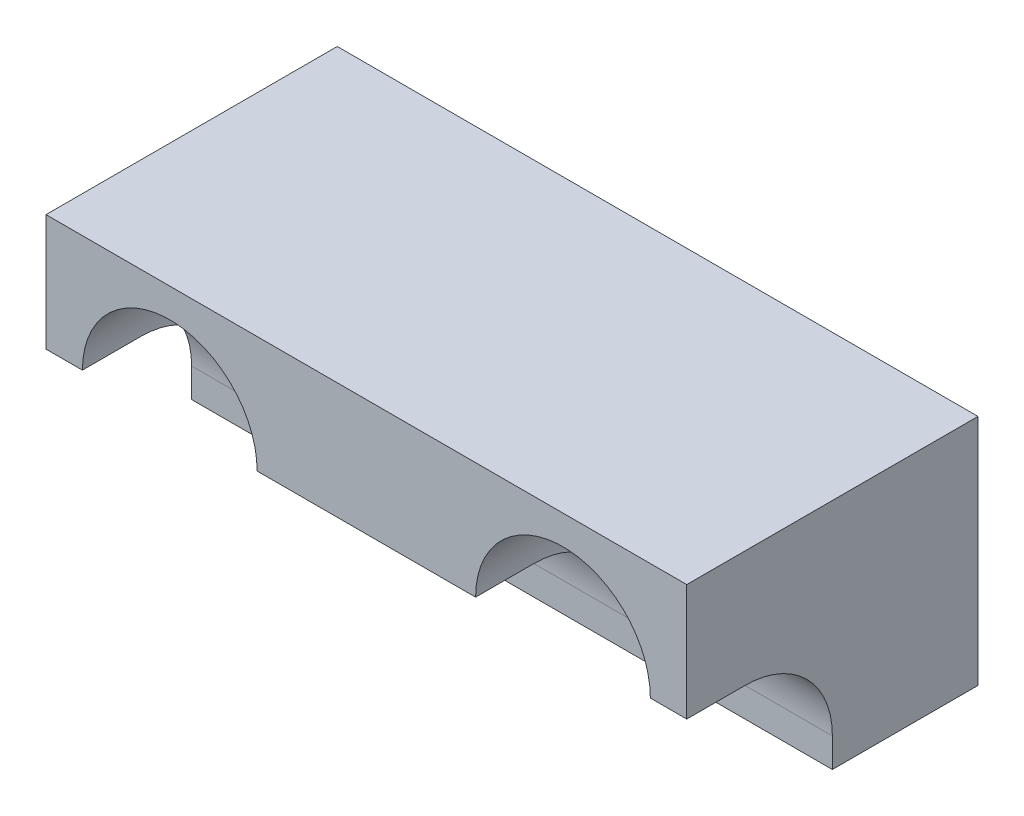
ISO-10303-21;
HEADER;
FILE_DESCRIPTION(('STEP AP214'),'2;1');
FILE_NAME('part.step','',(''),(''),'','','');
FILE_SCHEMA(('AUTOMOTIVE_DESIGN { 1 0 10303 214 1 1 1 1 }'));
ENDSEC;
DATA;
#1=APPLICATION_CONTEXT('core data for automotive mechanical design processes');
#2=APPLICATION_PROTOCOL_DEFINITION('international standard','automotive_design',2000,#1);
#3=PRODUCT_CONTEXT('',#1,'mechanical');
#4=PRODUCT('Part','Part','',(#3));
#5=PRODUCT_RELATED_PRODUCT_CATEGORY('part','',(#4));
#6=PRODUCT_DEFINITION_FORMATION('','',#4);
#7=PRODUCT_DEFINITION_CONTEXT('part definition',#1,'design');
#8=PRODUCT_DEFINITION('design','',#6,#7);
#9=PRODUCT_DEFINITION_SHAPE('','',#8);
#10=(LENGTH_UNIT() NAMED_UNIT(*) SI_UNIT(.MILLI.,.METRE.));
#11=(NAMED_UNIT(*) PLANE_ANGLE_UNIT() SI_UNIT($,.RADIAN.));
#12=(NAMED_UNIT(*) SI_UNIT($,.STERADIAN.) SOLID_ANGLE_UNIT());
#13=UNCERTAINTY_MEASURE_WITH_UNIT(LENGTH_MEASURE(1.E-05),#10,'distance_accuracy_value','');
#14=(GEOMETRIC_REPRESENTATION_CONTEXT(3) GLOBAL_UNCERTAINTY_ASSIGNED_CONTEXT((#13)) GLOBAL_UNIT_ASSIGNED_CONTEXT((#10,
#11,#12)) REPRESENTATION_CONTEXT('',''));
#15=CARTESIAN_POINT('',(0.,0.,0.));
#16=DIRECTION('',(0.,0.,1.));
#17=DIRECTION('',(1.,0.,0.));
#18=AXIS2_PLACEMENT_3D('',#15,#16,#17);
#19=CARTESIAN_POINT('',(0.,0.,5.));
#20=DIRECTION('',(0.,0.,-1.));
#21=DIRECTION('',(-1.,0.,0.));
#22=AXIS2_PLACEMENT_3D('',#19,#20,#21);
#23=PLANE('',#22);
#24=DIRECTION('',(0.,1.,0.));
#25=VECTOR('',#24,1.);
#26=CARTESIAN_POINT('',(11.,-4.,5.));
#27=LINE('',#26,#25);
#28=CARTESIAN_POINT('',(11.,-4.,5.));
#29=VERTEX_POINT('',#28);
#30=CARTESIAN_POINT('',(11.,-3.,5.));
#31=VERTEX_POINT('',#30);
#32=EDGE_CURVE('E214',#29,#31,#27,.T.);
#33=ORIENTED_EDGE('',*,*,#32,.T.);
#34=DIRECTION('',(1.,0.,0.));
#35=VECTOR('',#34,1.);
#36=CARTESIAN_POINT('',(9.75,-3.,5.));
#37=LINE('',#36,#35);
#38=CARTESIAN_POINT('',(6.75,-3.,5.));
#39=VERTEX_POINT('',#38);
#40=EDGE_CURVE('E242',#31,#39,#37,.F.);
#41=ORIENTED_EDGE('',*,*,#40,.T.);
#42=DIRECTION('',(1.,0.,0.));
#43=VECTOR('',#42,1.);
#44=CARTESIAN_POINT('',(-3.75,-3.,5.));
#45=LINE('',#44,#43);
#46=CARTESIAN_POINT('',(-6.75,-3.,5.));
#47=VERTEX_POINT('',#46);
#48=EDGE_CURVE('E237',#39,#47,#45,.F.);
#49=ORIENTED_EDGE('',*,*,#48,.T.);
#50=DIRECTION('',(1.,0.,0.));
#51=VECTOR('',#50,1.);
#52=CARTESIAN_POINT('',(-11.,-3.,5.));
#53=LINE('',#52,#51);
#54=CARTESIAN_POINT('',(-11.,-3.,5.));
#55=VERTEX_POINT('',#54);
#56=EDGE_CURVE('E240',#47,#55,#53,.F.);
#57=ORIENTED_EDGE('',*,*,#56,.T.);
#58=DIRECTION('',(0.,-1.,0.));
#59=VECTOR('',#58,1.);
#60=CARTESIAN_POINT('',(-11.,-4.,5.));
#61=LINE('',#60,#59);
#62=CARTESIAN_POINT('',(-11.,-4.,5.));
#63=VERTEX_POINT('',#62);
#64=EDGE_CURVE('E217',#55,#63,#61,.T.);
#65=ORIENTED_EDGE('',*,*,#64,.T.);
#66=DIRECTION('',(1.,0.,0.));
#67=VECTOR('',#66,1.);
#68=CARTESIAN_POINT('',(-11.,-4.,5.));
#69=LINE('',#68,#67);
#70=EDGE_CURVE('E220',#63,#29,#69,.T.);
#71=ORIENTED_EDGE('',*,*,#70,.T.);
#72=EDGE_LOOP('',(#33,#41,#49,#57,#65,#71));
#73=FACE_BOUND('',#72,.T.);
#74=ADVANCED_FACE('F33',(#73),#23,.F.);
#75=CARTESIAN_POINT('',(-6.75,0.,5.));
#76=DIRECTION('',(0.,0.,1.));
#77=DIRECTION('',(1.,0.,0.));
#78=AXIS2_PLACEMENT_3D('',#75,#76,#77);
#79=CIRCLE('',#78,1.5);
#80=CARTESIAN_POINT('',(-5.25,0.,5.));
#81=VERTEX_POINT('',#80);
#82=EDGE_CURVE('E208',#81,#81,#79,.T.);
#83=ORIENTED_EDGE('',*,*,#82,.F.);
#84=EDGE_LOOP('',(#83));
#85=FACE_BOUND('',#84,.T.);
#86=CARTESIAN_POINT('',(-6.75,0.,5.));
#87=DIRECTION('',(0.,0.,-1.));
#88=DIRECTION('',(-1.,0.,0.));
#89=AXIS2_PLACEMENT_3D('',#86,#87,#88);
#90=CIRCLE('',#89,3.);
#91=EDGE_CURVE('E147',#47,#47,#90,.T.);
#92=ORIENTED_EDGE('',*,*,#91,.F.);
#93=EDGE_LOOP('',(#92));
#94=FACE_BOUND('',#93,.T.);
#95=ADVANCED_FACE('F281',(#85,#94),#23,.F.);
#96=CARTESIAN_POINT('',(-11.,0.,10.));
#97=DIRECTION('',(0.,1.,0.));
#98=DIRECTION('',(0.,0.,1.));
#99=AXIS2_PLACEMENT_3D('',#96,#97,#98);
#100=PLANE('',#99);
#101=DIRECTION('',(0.,0.,-1.));
#102=VECTOR('',#101,1.);
#103=CARTESIAN_POINT('',(9.75,0.,10.));
#104=LINE('',#103,#102);
#105=CARTESIAN_POINT('',(9.75,0.,10.));
#106=VERTEX_POINT('',#105);
#107=CARTESIAN_POINT('',(9.75,0.,8.));
#108=VERTEX_POINT('',#107);
#109=EDGE_CURVE('E165',#106,#108,#104,.T.);
#110=ORIENTED_EDGE('',*,*,#109,.T.);
#111=DIRECTION('',(1.,0.,0.));
#112=VECTOR('',#111,1.);
#113=CARTESIAN_POINT('',(11.,0.,8.));
#114=LINE('',#113,#112);
#115=CARTESIAN_POINT('',(11.,0.,8.));
#116=VERTEX_POINT('',#115);
#117=EDGE_CURVE('E185',#108,#116,#114,.T.);
#118=ORIENTED_EDGE('',*,*,#117,.T.);
#119=DIRECTION('',(0.,0.,-1.));
#120=VECTOR('',#119,1.);
#121=CARTESIAN_POINT('',(11.,0.,10.));
#122=LINE('',#121,#120);
#123=CARTESIAN_POINT('',(11.,0.,10.));
#124=VERTEX_POINT('',#123);
#125=EDGE_CURVE('E183',#124,#116,#122,.T.);
#126=ORIENTED_EDGE('',*,*,#125,.F.);
#127=DIRECTION('',(1.,0.,0.));
#128=VECTOR('',#127,1.);
#129=CARTESIAN_POINT('',(-11.,0.,10.));
#130=LINE('',#129,#128);
#131=EDGE_CURVE('E158',#106,#124,#130,.T.);
#132=ORIENTED_EDGE('',*,*,#131,.F.);
#133=EDGE_LOOP('',(#110,#118,#126,#132));
#134=FACE_BOUND('',#133,.T.);
#135=ADVANCED_FACE('F179',(#134),#100,.F.);
#136=DIRECTION('',(0.,0.,-1.));
#137=VECTOR('',#136,1.);
#138=CARTESIAN_POINT('',(-3.75,0.,10.));
#139=LINE('',#138,#137);
#140=CARTESIAN_POINT('',(-3.75,0.,10.));
#141=VERTEX_POINT('',#140);
#142=CARTESIAN_POINT('',(-3.75,0.,8.));
#143=VERTEX_POINT('',#142);
#144=EDGE_CURVE('E137',#141,#143,#139,.T.);
#145=ORIENTED_EDGE('',*,*,#144,.T.);
#146=DIRECTION('',(1.,0.,0.));
#147=VECTOR('',#146,1.);
#148=CARTESIAN_POINT('',(3.75,0.,8.));
#149=LINE('',#148,#147);
#150=CARTESIAN_POINT('',(3.75,0.,8.));
#151=VERTEX_POINT('',#150);
#152=EDGE_CURVE('E246',#143,#151,#149,.T.);
#153=ORIENTED_EDGE('',*,*,#152,.T.);
#154=DIRECTION('',(0.,0.,-1.));
#155=VECTOR('',#154,1.);
#156=CARTESIAN_POINT('',(3.75,0.,10.));
#157=LINE('',#156,#155);
#158=CARTESIAN_POINT('',(3.75,0.,10.));
#159=VERTEX_POINT('',#158);
#160=EDGE_CURVE('E167',#151,#159,#157,.F.);
#161=ORIENTED_EDGE('',*,*,#160,.T.);
#162=EDGE_CURVE('E156',#141,#159,#130,.T.);
#163=ORIENTED_EDGE('',*,*,#162,.F.);
#164=EDGE_LOOP('',(#145,#153,#161,#163));
#165=FACE_BOUND('',#164,.T.);
#166=ADVANCED_FACE('F293',(#165),#100,.F.);
#167=CARTESIAN_POINT('',(6.75,0.,5.));
#168=DIRECTION('',(0.,0.,-1.));
#169=DIRECTION('',(-1.,0.,0.));
#170=AXIS2_PLACEMENT_3D('',#167,#168,#169);
#171=CIRCLE('',#170,3.);
#172=EDGE_CURVE('E146',#39,#39,#171,.T.);
#173=ORIENTED_EDGE('',*,*,#172,.F.);
#174=EDGE_LOOP('',(#173));
#175=FACE_BOUND('',#174,.T.);
#176=CARTESIAN_POINT('',(6.75,0.,5.));
#177=DIRECTION('',(0.,0.,1.));
#178=DIRECTION('',(1.,0.,0.));
#179=AXIS2_PLACEMENT_3D('',#176,#177,#178);
#180=CIRCLE('',#179,1.5);
#181=CARTESIAN_POINT('',(8.25,0.,5.));
#182=VERTEX_POINT('',#181);
#183=EDGE_CURVE('E202',#182,#182,#180,.T.);
#184=ORIENTED_EDGE('',*,*,#183,.F.);
#185=EDGE_LOOP('',(#184));
#186=FACE_BOUND('',#185,.T.);
#187=ADVANCED_FACE('F284',(#175,#186),#23,.F.);
#188=CARTESIAN_POINT('',(0.,0.,0.));
#189=DIRECTION('',(0.,0.,-1.));
#190=DIRECTION('',(-1.,0.,0.));
#191=AXIS2_PLACEMENT_3D('',#188,#189,#190);
#192=PLANE('',#191);
#193=CARTESIAN_POINT('',(-6.75,0.,0.));
#194=DIRECTION('',(0.,0.,1.));
#195=DIRECTION('',(1.,0.,0.));
#196=AXIS2_PLACEMENT_3D('',#193,#194,#195);
#197=CIRCLE('',#196,1.5);
#198=CARTESIAN_POINT('',(-5.25,0.,0.));
#199=VERTEX_POINT('',#198);
#200=EDGE_CURVE('E205',#199,#199,#197,.T.);
#201=ORIENTED_EDGE('',*,*,#200,.T.);
#202=EDGE_LOOP('',(#201));
#203=FACE_BOUND('',#202,.T.);
#204=DIRECTION('',(0.,1.,0.));
#205=VECTOR('',#204,1.);
#206=CARTESIAN_POINT('',(11.,-4.,0.));
#207=LINE('',#206,#205);
#208=CARTESIAN_POINT('',(11.,-4.,0.));
#209=VERTEX_POINT('',#208);
#210=CARTESIAN_POINT('',(11.,4.,0.));
#211=VERTEX_POINT('',#210);
#212=EDGE_CURVE('E211',#209,#211,#207,.T.);
#213=ORIENTED_EDGE('',*,*,#212,.F.);
#214=DIRECTION('',(1.,0.,0.));
#215=VECTOR('',#214,1.);
#216=CARTESIAN_POINT('',(-11.,-4.,0.));
#217=LINE('',#216,#215);
#218=CARTESIAN_POINT('',(-11.,-4.,0.));
#219=VERTEX_POINT('',#218);
#220=EDGE_CURVE('E218',#219,#209,#217,.T.);
#221=ORIENTED_EDGE('',*,*,#220,.F.);
#222=DIRECTION('',(0.,-1.,0.));
#223=VECTOR('',#222,1.);
#224=CARTESIAN_POINT('',(-11.,-4.,0.));
#225=LINE('',#224,#223);
#226=CARTESIAN_POINT('',(-11.,4.,0.));
#227=VERTEX_POINT('',#226);
#228=EDGE_CURVE('E226',#227,#219,#225,.T.);
#229=ORIENTED_EDGE('',*,*,#228,.F.);
#230=DIRECTION('',(-1.,0.,0.));
#231=VECTOR('',#230,1.);
#232=CARTESIAN_POINT('',(-11.,4.,0.));
#233=LINE('',#232,#231);
#234=EDGE_CURVE('E224',#211,#227,#233,.T.);
#235=ORIENTED_EDGE('',*,*,#234,.F.);
#236=EDGE_LOOP('',(#213,#221,#229,#235));
#237=FACE_BOUND('',#236,.T.);
#238=CARTESIAN_POINT('',(6.75,0.,0.));
#239=DIRECTION('',(0.,0.,1.));
#240=DIRECTION('',(1.,0.,0.));
#241=AXIS2_PLACEMENT_3D('',#238,#239,#240);
#242=CIRCLE('',#241,1.5);
#243=CARTESIAN_POINT('',(8.25,0.,0.));
#244=VERTEX_POINT('',#243);
#245=EDGE_CURVE('E201',#244,#244,#242,.T.);
#246=ORIENTED_EDGE('',*,*,#245,.T.);
#247=EDGE_LOOP('',(#246));
#248=FACE_BOUND('',#247,.T.);
#249=ADVANCED_FACE('F292',(#203,#237,#248),#192,.T.);
#250=CARTESIAN_POINT('',(11.,-4.,5.));
#251=DIRECTION('',(-1.,0.,0.));
#252=DIRECTION('',(0.,0.,1.));
#253=AXIS2_PLACEMENT_3D('',#250,#251,#252);
#254=PLANE('',#253);
#255=ORIENTED_EDGE('',*,*,#212,.T.);
#256=DIRECTION('',(0.,0.,-1.));
#257=VECTOR('',#256,1.);
#258=CARTESIAN_POINT('',(11.,4.,5.));
#259=LINE('',#258,#257);
#260=CARTESIAN_POINT('',(11.,4.,10.));
#261=VERTEX_POINT('',#260);
#262=EDGE_CURVE('E192',#261,#211,#259,.T.);
#263=ORIENTED_EDGE('',*,*,#262,.F.);
#264=DIRECTION('',(0.,1.,0.));
#265=VECTOR('',#264,1.);
#266=CARTESIAN_POINT('',(11.,4.,10.));
#267=LINE('',#266,#265);
#268=EDGE_CURVE('E155',#124,#261,#267,.T.);
#269=ORIENTED_EDGE('',*,*,#268,.F.);
#270=ORIENTED_EDGE('',*,*,#125,.T.);
#271=CARTESIAN_POINT('',(11.,-3.,8.));
#272=DIRECTION('',(-1.,0.,0.));
#273=DIRECTION('',(0.,0.,1.));
#274=AXIS2_PLACEMENT_3D('',#271,#272,#273);
#275=CIRCLE('',#274,3.);
#276=EDGE_CURVE('E248',#116,#31,#275,.T.);
#277=ORIENTED_EDGE('',*,*,#276,.T.);
#278=ORIENTED_EDGE('',*,*,#32,.F.);
#279=DIRECTION('',(0.,0.,-1.));
#280=VECTOR('',#279,1.);
#281=CARTESIAN_POINT('',(11.,-4.,5.));
#282=LINE('',#281,#280);
#283=EDGE_CURVE('E222',#29,#209,#282,.T.);
#284=ORIENTED_EDGE('',*,*,#283,.T.);
#285=EDGE_LOOP('',(#255,#263,#269,#270,#277,#278,#284));
#286=FACE_BOUND('',#285,.T.);
#287=ADVANCED_FACE('F190',(#286),#254,.F.);
#288=CARTESIAN_POINT('',(-11.,4.,5.));
#289=DIRECTION('',(0.,-1.,0.));
#290=DIRECTION('',(0.,0.,-1.));
#291=AXIS2_PLACEMENT_3D('',#288,#289,#290);
#292=PLANE('',#291);
#293=ORIENTED_EDGE('',*,*,#234,.T.);
#294=DIRECTION('',(0.,0.,-1.));
#295=VECTOR('',#294,1.);
#296=CARTESIAN_POINT('',(-11.,4.,5.));
#297=LINE('',#296,#295);
#298=CARTESIAN_POINT('',(-11.,4.,10.));
#299=VERTEX_POINT('',#298);
#300=EDGE_CURVE('E197',#299,#227,#297,.T.);
#301=ORIENTED_EDGE('',*,*,#300,.F.);
#302=DIRECTION('',(-1.,0.,0.));
#303=VECTOR('',#302,1.);
#304=CARTESIAN_POINT('',(-11.,4.,10.));
#305=LINE('',#304,#303);
#306=EDGE_CURVE('E160',#261,#299,#305,.T.);
#307=ORIENTED_EDGE('',*,*,#306,.F.);
#308=ORIENTED_EDGE('',*,*,#262,.T.);
#309=EDGE_LOOP('',(#293,#301,#307,#308));
#310=FACE_BOUND('',#309,.T.);
#311=ADVANCED_FACE('F195',(#310),#292,.F.);
#312=CARTESIAN_POINT('',(-11.,-4.,5.));
#313=DIRECTION('',(1.,0.,0.));
#314=DIRECTION('',(0.,0.,-1.));
#315=AXIS2_PLACEMENT_3D('',#312,#313,#314);
#316=PLANE('',#315);
#317=ORIENTED_EDGE('',*,*,#228,.T.);
#318=DIRECTION('',(0.,0.,-1.));
#319=VECTOR('',#318,1.);
#320=CARTESIAN_POINT('',(-11.,-4.,5.));
#321=LINE('',#320,#319);
#322=EDGE_CURVE('E231',#63,#219,#321,.T.);
#323=ORIENTED_EDGE('',*,*,#322,.F.);
#324=ORIENTED_EDGE('',*,*,#64,.F.);
#325=CARTESIAN_POINT('',(-11.,-3.,8.));
#326=DIRECTION('',(1.,0.,0.));
#327=DIRECTION('',(0.,0.,-1.));
#328=AXIS2_PLACEMENT_3D('',#325,#326,#327);
#329=CIRCLE('',#328,3.);
#330=CARTESIAN_POINT('',(-11.,0.,8.));
#331=VERTEX_POINT('',#330);
#332=EDGE_CURVE('E467',#55,#331,#329,.T.);
#333=ORIENTED_EDGE('',*,*,#332,.T.);
#334=DIRECTION('',(0.,0.,-1.));
#335=VECTOR('',#334,1.);
#336=CARTESIAN_POINT('',(-11.,0.,10.));
#337=LINE('',#336,#335);
#338=CARTESIAN_POINT('',(-11.,0.,10.));
#339=VERTEX_POINT('',#338);
#340=EDGE_CURVE('E187',#339,#331,#337,.T.);
#341=ORIENTED_EDGE('',*,*,#340,.F.);
#342=DIRECTION('',(0.,-1.,0.));
#343=VECTOR('',#342,1.);
#344=CARTESIAN_POINT('',(-11.,4.,10.));
#345=LINE('',#344,#343);
#346=EDGE_CURVE('E153',#299,#339,#345,.T.);
#347=ORIENTED_EDGE('',*,*,#346,.F.);
#348=ORIENTED_EDGE('',*,*,#300,.T.);
#349=EDGE_LOOP('',(#317,#323,#324,#333,#341,#347,#348));
#350=FACE_BOUND('',#349,.T.);
#351=ADVANCED_FACE('F393',(#350),#316,.F.);
#352=CARTESIAN_POINT('',(-11.,-4.,5.));
#353=DIRECTION('',(0.,1.,0.));
#354=DIRECTION('',(0.,0.,1.));
#355=AXIS2_PLACEMENT_3D('',#352,#353,#354);
#356=PLANE('',#355);
#357=ORIENTED_EDGE('',*,*,#220,.T.);
#358=ORIENTED_EDGE('',*,*,#283,.F.);
#359=ORIENTED_EDGE('',*,*,#70,.F.);
#360=ORIENTED_EDGE('',*,*,#322,.T.);
#361=EDGE_LOOP('',(#357,#358,#359,#360));
#362=FACE_BOUND('',#361,.T.);
#363=ADVANCED_FACE('F316',(#362),#356,.F.);
#364=CARTESIAN_POINT('',(-6.75,0.,5.));
#365=DIRECTION('',(0.,0.,-1.));
#366=DIRECTION('',(-1.,0.,0.));
#367=AXIS2_PLACEMENT_3D('',#364,#365,#366);
#368=CYLINDRICAL_SURFACE('',#367,1.5);
#369=ORIENTED_EDGE('',*,*,#82,.T.);
#370=EDGE_LOOP('',(#369));
#371=FACE_BOUND('',#370,.T.);
#372=ORIENTED_EDGE('',*,*,#200,.F.);
#373=EDGE_LOOP('',(#372));
#374=FACE_BOUND('',#373,.T.);
#375=ADVANCED_FACE('F308',(#371,#374),#368,.F.);
#376=CARTESIAN_POINT('',(6.75,0.,5.));
#377=DIRECTION('',(0.,0.,-1.));
#378=DIRECTION('',(-1.,0.,0.));
#379=AXIS2_PLACEMENT_3D('',#376,#377,#378);
#380=CYLINDRICAL_SURFACE('',#379,1.5);
#381=ORIENTED_EDGE('',*,*,#183,.T.);
#382=EDGE_LOOP('',(#381));
#383=FACE_BOUND('',#382,.T.);
#384=ORIENTED_EDGE('',*,*,#245,.F.);
#385=EDGE_LOOP('',(#384));
#386=FACE_BOUND('',#385,.T.);
#387=ADVANCED_FACE('F305',(#383,#386),#380,.F.);
#388=ORIENTED_EDGE('',*,*,#340,.T.);
#389=DIRECTION('',(1.,0.,0.));
#390=VECTOR('',#389,1.);
#391=CARTESIAN_POINT('',(-9.75,0.,8.));
#392=LINE('',#391,#390);
#393=CARTESIAN_POINT('',(-9.75,0.,8.));
#394=VERTEX_POINT('',#393);
#395=EDGE_CURVE('E135',#331,#394,#392,.T.);
#396=ORIENTED_EDGE('',*,*,#395,.T.);
#397=DIRECTION('',(0.,0.,-1.));
#398=VECTOR('',#397,1.);
#399=CARTESIAN_POINT('',(-9.75,0.,10.));
#400=LINE('',#399,#398);
#401=CARTESIAN_POINT('',(-9.75,0.,10.));
#402=VERTEX_POINT('',#401);
#403=EDGE_CURVE('E127',#394,#402,#400,.F.);
#404=ORIENTED_EDGE('',*,*,#403,.T.);
#405=EDGE_CURVE('E132',#339,#402,#130,.T.);
#406=ORIENTED_EDGE('',*,*,#405,.F.);
#407=EDGE_LOOP('',(#388,#396,#404,#406));
#408=FACE_BOUND('',#407,.T.);
#409=ADVANCED_FACE('F130',(#408),#100,.F.);
#410=CARTESIAN_POINT('',(0.,0.,10.));
#411=DIRECTION('',(0.,0.,1.));
#412=DIRECTION('',(1.,0.,0.));
#413=AXIS2_PLACEMENT_3D('',#410,#411,#412);
#414=PLANE('',#413);
#415=CARTESIAN_POINT('',(6.75,0.,10.));
#416=DIRECTION('',(0.,0.,-1.));
#417=DIRECTION('',(-1.,0.,0.));
#418=AXIS2_PLACEMENT_3D('',#415,#416,#417);
#419=CIRCLE('',#418,3.);
#420=EDGE_CURVE('E138',#159,#106,#419,.T.);
#421=ORIENTED_EDGE('',*,*,#420,.T.);
#422=ORIENTED_EDGE('',*,*,#131,.T.);
#423=ORIENTED_EDGE('',*,*,#268,.T.);
#424=ORIENTED_EDGE('',*,*,#306,.T.);
#425=ORIENTED_EDGE('',*,*,#346,.T.);
#426=ORIENTED_EDGE('',*,*,#405,.T.);
#427=CARTESIAN_POINT('',(-6.75,0.,10.));
#428=DIRECTION('',(0.,0.,-1.));
#429=DIRECTION('',(-1.,0.,0.));
#430=AXIS2_PLACEMENT_3D('',#427,#428,#429);
#431=CIRCLE('',#430,3.);
#432=EDGE_CURVE('E141',#402,#141,#431,.T.);
#433=ORIENTED_EDGE('',*,*,#432,.T.);
#434=ORIENTED_EDGE('',*,*,#162,.T.);
#435=EDGE_LOOP('',(#421,#422,#423,#424,#425,#426,#433,#434));
#436=FACE_BOUND('',#435,.T.);
#437=ADVANCED_FACE('F150',(#436),#414,.T.);
#438=CARTESIAN_POINT('',(-6.75,0.,10.));
#439=DIRECTION('',(0.,0.,-1.));
#440=DIRECTION('',(-1.,0.,0.));
#441=AXIS2_PLACEMENT_3D('',#438,#439,#440);
#442=CYLINDRICAL_SURFACE('',#441,3.);
#443=ORIENTED_EDGE('',*,*,#432,.F.);
#444=ORIENTED_EDGE('',*,*,#403,.F.);
#445=CARTESIAN_POINT('',(-9.75,0.,8.));
#446=CARTESIAN_POINT('',(-9.7499742542119,8.70117092402358E-06,7.91648721347913));
#447=CARTESIAN_POINT('',(-9.74999919002557,-0.00348683371941922,7.83297564664489));
#448=CARTESIAN_POINT('',(-9.74996437324022,-0.0174237793873351,7.66653448961));
#449=CARTESIAN_POINT('',(-9.74990462115681,-0.0278651478770789,7.58360489586926));
#450=CARTESIAN_POINT('',(-9.74951403800987,-0.0556555827604354,7.41876135883009));
#451=CARTESIAN_POINT('',(-9.74918273036921,-0.0730167658160934,7.33684945833349));
#452=CARTESIAN_POINT('',(-9.7478856829385,-0.114521091377206,7.17476758070851));
#453=CARTESIAN_POINT('',(-9.746919951357,-0.138664146132445,7.09459758105624));
#454=CARTESIAN_POINT('',(-9.74387405147011,-0.193581567204843,6.93650390680158));
#455=CARTESIAN_POINT('',(-9.74179292557354,-0.224361617941497,6.85858222309648));
#456=CARTESIAN_POINT('',(-9.73591899970483,-0.292320236229917,6.70559715283823));
#457=CARTESIAN_POINT('',(-9.73212535807626,-0.329501944462847,6.63053519145773));
#458=CARTESIAN_POINT('',(-9.72213985150084,-0.40990715480478,6.4839521366029));
#459=CARTESIAN_POINT('',(-9.71594974906587,-0.453126201768672,6.41242848432597));
#460=CARTESIAN_POINT('',(-9.70041644033445,-0.545177918798996,6.27350477907446));
#461=CARTESIAN_POINT('',(-9.69107521881053,-0.594007042552509,6.20610216190273));
#462=CARTESIAN_POINT('',(-9.66887939514974,-0.694766057870571,6.07847710273515));
#463=CARTESIAN_POINT('',(-9.65617339810132,-0.746505012734441,6.0180783705127));
#464=CARTESIAN_POINT('',(-9.62642042750599,-0.853997612791838,5.90216393374337));
#465=CARTESIAN_POINT('',(-9.60937585028495,-0.909749029631128,5.84664555633254));
#466=CARTESIAN_POINT('',(-9.57032529473745,-1.02441614168453,5.74098692128325));
#467=CARTESIAN_POINT('',(-9.54832432064532,-1.0833285999568,5.69084131385461));
#468=CARTESIAN_POINT('',(-9.49883315091997,-1.20338169859462,5.59625304372244));
#469=CARTESIAN_POINT('',(-9.4713439106332,-1.26452194965455,5.55180939068416));
#470=CARTESIAN_POINT('',(-9.41468460966073,-1.3794871949622,5.47451722162952));
#471=CARTESIAN_POINT('',(-9.38625556065377,-1.43317216047316,5.44091401931685));
#472=CARTESIAN_POINT('',(-9.32493793719987,-1.54062378554782,5.37815083109316));
#473=CARTESIAN_POINT('',(-9.29204796826319,-1.59439046543791,5.34899224065172));
#474=CARTESIAN_POINT('',(-9.22184175433683,-1.70119898901481,5.29506119487445));
#475=CARTESIAN_POINT('',(-9.18452705153268,-1.75424107810234,5.27028721879635));
#476=CARTESIAN_POINT('',(-9.10559189296625,-1.85889613304526,5.22490705961105));
#477=CARTESIAN_POINT('',(-9.06396977483469,-1.91050853732507,5.20430249474728));
#478=CARTESIAN_POINT('',(-8.93804553014366,-2.05626299068615,5.15050262838392));
#479=CARTESIAN_POINT('',(-8.84847880587433,-2.14776514544236,5.12223133391004));
#480=CARTESIAN_POINT('',(-8.65684490292335,-2.31960343278214,5.07681693751965));
#481=CARTESIAN_POINT('',(-8.55477472204774,-2.39993687373126,5.05967651447669));
#482=CARTESIAN_POINT('',(-8.32978618993133,-2.55434526471839,5.03214864283832));
#483=CARTESIAN_POINT('',(-8.20580434257178,-2.62701609628219,5.02259644061977));
#484=CARTESIAN_POINT('',(-7.9483641146747,-2.7540051655726,5.00941685009246));
#485=CARTESIAN_POINT('',(-7.81489793320139,-2.80830807908633,5.00579439930442));
#486=CARTESIAN_POINT('',(-7.60349864787223,-2.87710726525327,5.00242199021814));
#487=CARTESIAN_POINT('',(-7.52774981708906,-2.89849933282714,5.00166158575046));
#488=CARTESIAN_POINT('',(-7.37478106781804,-2.93527364149273,5.00064147476753));
#489=CARTESIAN_POINT('',(-7.29756101896835,-2.95065534739584,5.00038181283246));
#490=CARTESIAN_POINT('',(-7.14219105636118,-2.97529318753805,5.00007517346278));
#491=CARTESIAN_POINT('',(-7.06404159901899,-2.98455221154377,5.00002809563205));
#492=CARTESIAN_POINT('',(-6.90726230315864,-2.99690853233646,5.00000054521932));
#493=CARTESIAN_POINT('',(-6.8286324963443,-3.00000623146601,5.00002006828797));
#494=CARTESIAN_POINT('',(-6.75,-3.,5.));
#495=B_SPLINE_CURVE_WITH_KNOTS('',3,(#445,#446,#447,#448,#449,#450,#451,#452,#453,#454,#455,
#456,#457,#458,#459,#460,#461,#462,#463,#464,#465,#466,#467,#468,#469,#470,#471,#472,#473,#474,
#475,#476,#477,#478,#479,#480,#481,#482,#483,#484,#485,#486,#487,#488,#489,#490,#491,#492,#493,
#494),.UNSPECIFIED.,.F.,.F.,(4,2,2,2,2,2,2,2,2,2,2,2,2,2,2,2,2,2,2,2,2,2,2,2,4),(0.,
0.250463504184519,0.500925483503707,0.751827964491764,1.00272719921772,1.25384218245193,
1.50508071668819,1.75613482385013,2.00703109572428,2.24829786825918,2.48943167010185,
2.73032309333807,2.97117262093231,3.17916209948991,3.38721674634572,3.5951990903332,
3.80326200282563,4.19483860442291,4.58650941210566,5.01690577111382,5.44766032590578,
5.68359780105507,5.9195562803125,6.15540331289395,6.39123494384964),.UNSPECIFIED.);
#496=EDGE_CURVE('E258',#394,#47,#495,.T.);
#497=ORIENTED_EDGE('',*,*,#496,.T.);
#498=ORIENTED_EDGE('',*,*,#91,.T.);
#499=CARTESIAN_POINT('',(-6.75,-3.,5.));
#500=CARTESIAN_POINT('',(-6.66648721347913,-3.00000870117092,5.0000257457881));
#501=CARTESIAN_POINT('',(-6.58297564664489,-2.99651316628058,5.00000080997444));
#502=CARTESIAN_POINT('',(-6.41653448961,-2.98257622061266,5.00003562675978));
#503=CARTESIAN_POINT('',(-6.33360489586926,-2.97213485212292,5.00009537884319));
#504=CARTESIAN_POINT('',(-6.16876135883009,-2.94434441723956,5.00048596199013));
#505=CARTESIAN_POINT('',(-6.08684945833349,-2.92698323418391,5.00081726963079));
#506=CARTESIAN_POINT('',(-5.92476758070851,-2.88547890862279,5.00211431706151));
#507=CARTESIAN_POINT('',(-5.84459758105624,-2.86133585386756,5.00308004864301));
#508=CARTESIAN_POINT('',(-5.68650390680158,-2.80641843279516,5.00612594852989));
#509=CARTESIAN_POINT('',(-5.60858222309648,-2.7756383820585,5.00820707442646));
#510=CARTESIAN_POINT('',(-5.45559715283823,-2.70767976377008,5.01408100029517));
#511=CARTESIAN_POINT('',(-5.38053519145773,-2.67049805553715,5.01787464192374));
#512=CARTESIAN_POINT('',(-5.2339521366029,-2.59009284519522,5.02786014849917));
#513=CARTESIAN_POINT('',(-5.16242848432597,-2.54687379823133,5.03405025093413));
#514=CARTESIAN_POINT('',(-5.02350477907445,-2.454822081201,5.04958355966555));
#515=CARTESIAN_POINT('',(-4.95610216190273,-2.40599295744749,5.05892478118947));
#516=CARTESIAN_POINT('',(-4.82847710273515,-2.30523394212943,5.08112060485026));
#517=CARTESIAN_POINT('',(-4.7680783705127,-2.25349498726556,5.09382660189868));
#518=CARTESIAN_POINT('',(-4.65216393374337,-2.14600238720816,5.12357957249401));
#519=CARTESIAN_POINT('',(-4.59664555633254,-2.09025097036887,5.14062414971505));
#520=CARTESIAN_POINT('',(-4.49098692128325,-1.97558385831547,5.17967470526256));
#521=CARTESIAN_POINT('',(-4.44084131385461,-1.9166714000432,5.20167567935468));
#522=CARTESIAN_POINT('',(-4.34625304372244,-1.79661830140538,5.25116684908003));
#523=CARTESIAN_POINT('',(-4.30180939068416,-1.73547805034545,5.2786560893668));
#524=CARTESIAN_POINT('',(-4.22451722162952,-1.62051280503781,5.33531539033927));
#525=CARTESIAN_POINT('',(-4.19091401931685,-1.56682783952685,5.36374443934623));
#526=CARTESIAN_POINT('',(-4.12815083109316,-1.45937621445219,5.42506206280013));
#527=CARTESIAN_POINT('',(-4.09899224065172,-1.40560953456209,5.45795203173681));
#528=CARTESIAN_POINT('',(-4.04506119487445,-1.29880101098519,5.52815824566317));
#529=CARTESIAN_POINT('',(-4.02028721879635,-1.24575892189766,5.56547294846732));
#530=CARTESIAN_POINT('',(-3.97490705961105,-1.14110386695474,5.64440810703375));
#531=CARTESIAN_POINT('',(-3.95430249474728,-1.08949146267493,5.68603022516531));
#532=CARTESIAN_POINT('',(-3.90050262838392,-0.943737009313845,5.81195446985634));
#533=CARTESIAN_POINT('',(-3.87223133391004,-0.852234854557635,5.90152119412567));
#534=CARTESIAN_POINT('',(-3.82681693751965,-0.680396567217865,6.09315509707665));
#535=CARTESIAN_POINT('',(-3.80967651447669,-0.600063126268744,6.19522527795226));
#536=CARTESIAN_POINT('',(-3.78214864283832,-0.445654735281607,6.42021381006867));
#537=CARTESIAN_POINT('',(-3.77259644061977,-0.372983903717808,6.54419565742822));
#538=CARTESIAN_POINT('',(-3.75941685009246,-0.245994834427399,6.8016358853253));
#539=CARTESIAN_POINT('',(-3.75579439930442,-0.191691920913666,6.93510206679861));
#540=CARTESIAN_POINT('',(-3.75242199021814,-0.122892734746728,7.14650135212777));
#541=CARTESIAN_POINT('',(-3.75166158575046,-0.101500667172855,7.22225018291094));
#542=CARTESIAN_POINT('',(-3.75064147476753,-0.0647263585072722,7.37521893218196));
#543=CARTESIAN_POINT('',(-3.75038181283246,-0.0493446526041567,7.45243898103165));
#544=CARTESIAN_POINT('',(-3.75007517346278,-0.0247068124619506,7.60780894363882));
#545=CARTESIAN_POINT('',(-3.75002809563205,-0.0154477884562294,7.68595840098101));
#546=CARTESIAN_POINT('',(-3.75000054521932,-0.00309146766353917,7.84273769684136));
#547=CARTESIAN_POINT('',(-3.75002006828797,6.23146601220233E-06,7.9213675036557));
#548=CARTESIAN_POINT('',(-3.75,0.,8.));
#549=B_SPLINE_CURVE_WITH_KNOTS('',3,(#499,#500,#501,#502,#503,#504,#505,#506,#507,#508,#509,
#510,#511,#512,#513,#514,#515,#516,#517,#518,#519,#520,#521,#522,#523,#524,#525,#526,#527,#528,
#529,#530,#531,#532,#533,#534,#535,#536,#537,#538,#539,#540,#541,#542,#543,#544,#545,#546,#547,
#548),.UNSPECIFIED.,.F.,.F.,(4,2,2,2,2,2,2,2,2,2,2,2,2,2,2,2,2,2,2,2,2,2,2,2,4),(0.,
0.25046350418452,0.500925483503707,0.751827964491764,1.00272719921772,1.25384218245193,
1.50508071668819,1.75613482385013,2.00703109572428,2.24829786825918,2.48943167010185,
2.73032309333807,2.97117262093231,3.1791620994899,3.38721674634571,3.5951990903332,
3.80326200282563,4.19483860442291,4.58650941210566,5.01690577111383,5.44766032590578,
5.68359780105507,5.9195562803125,6.15540331289395,6.39123494384964),.UNSPECIFIED.);
#550=EDGE_CURVE('E11',#47,#143,#549,.T.);
#551=ORIENTED_EDGE('',*,*,#550,.T.);
#552=ORIENTED_EDGE('',*,*,#144,.F.);
#553=EDGE_LOOP('',(#443,#444,#497,#498,#551,#552));
#554=FACE_BOUND('',#553,.T.);
#555=ADVANCED_FACE('F142',(#554),#442,.F.);
#556=CARTESIAN_POINT('',(6.75,0.,10.));
#557=DIRECTION('',(0.,0.,-1.));
#558=DIRECTION('',(-1.,0.,0.));
#559=AXIS2_PLACEMENT_3D('',#556,#557,#558);
#560=CYLINDRICAL_SURFACE('',#559,3.);
#561=ORIENTED_EDGE('',*,*,#420,.F.);
#562=ORIENTED_EDGE('',*,*,#160,.F.);
#563=CARTESIAN_POINT('',(3.75,0.,8.));
#564=CARTESIAN_POINT('',(3.7500257457881,8.70117092400967E-06,7.91648721347913));
#565=CARTESIAN_POINT('',(3.75000080997444,-0.00348683371941923,7.83297564664489));
#566=CARTESIAN_POINT('',(3.75003562675978,-0.0174237793873351,7.66653448961));
#567=CARTESIAN_POINT('',(3.75009537884319,-0.0278651478770789,7.58360489586926));
#568=CARTESIAN_POINT('',(3.75048596199013,-0.0556555827604354,7.41876135883009));
#569=CARTESIAN_POINT('',(3.75081726963079,-0.0730167658160934,7.33684945833349));
#570=CARTESIAN_POINT('',(3.75211431706151,-0.114521091377206,7.17476758070851));
#571=CARTESIAN_POINT('',(3.75308004864301,-0.138664146132445,7.09459758105624));
#572=CARTESIAN_POINT('',(3.75612594852989,-0.193581567204843,6.93650390680158));
#573=CARTESIAN_POINT('',(3.75820707442646,-0.224361617941497,6.85858222309648));
#574=CARTESIAN_POINT('',(3.76408100029517,-0.292320236229917,6.70559715283823));
#575=CARTESIAN_POINT('',(3.76787464192374,-0.329501944462847,6.63053519145773));
#576=CARTESIAN_POINT('',(3.77786014849917,-0.40990715480478,6.4839521366029));
#577=CARTESIAN_POINT('',(3.78405025093413,-0.453126201768672,6.41242848432597));
#578=CARTESIAN_POINT('',(3.79958355966555,-0.545177918798996,6.27350477907445));
#579=CARTESIAN_POINT('',(3.80892478118947,-0.594007042552509,6.20610216190273));
#580=CARTESIAN_POINT('',(3.83112060485026,-0.694766057870571,6.07847710273515));
#581=CARTESIAN_POINT('',(3.84382660189868,-0.74650501273444,6.0180783705127));
#582=CARTESIAN_POINT('',(3.87357957249401,-0.853997612791837,5.90216393374337));
#583=CARTESIAN_POINT('',(3.89062414971505,-0.909749029631127,5.84664555633255));
#584=CARTESIAN_POINT('',(3.92967470526256,-1.02441614168453,5.74098692128325));
#585=CARTESIAN_POINT('',(3.95167567935468,-1.0833285999568,5.69084131385461));
#586=CARTESIAN_POINT('',(4.00116684908003,-1.20338169859462,5.59625304372244));
#587=CARTESIAN_POINT('',(4.0286560893668,-1.26452194965455,5.55180939068416));
#588=CARTESIAN_POINT('',(4.08531539033927,-1.37948719496219,5.47451722162952));
#589=CARTESIAN_POINT('',(4.11374443934623,-1.43317216047315,5.44091401931685));
#590=CARTESIAN_POINT('',(4.17506206280013,-1.54062378554781,5.37815083109316));
#591=CARTESIAN_POINT('',(4.20795203173681,-1.59439046543791,5.34899224065172));
#592=CARTESIAN_POINT('',(4.27815824566318,-1.70119898901481,5.29506119487445));
#593=CARTESIAN_POINT('',(4.31547294846732,-1.75424107810234,5.27028721879635));
#594=CARTESIAN_POINT('',(4.39440810703375,-1.85889613304526,5.22490705961105));
#595=CARTESIAN_POINT('',(4.43603022516531,-1.91050853732507,5.20430249474728));
#596=CARTESIAN_POINT('',(4.56195446985634,-2.05626299068615,5.15050262838392));
#597=CARTESIAN_POINT('',(4.65152119412568,-2.14776514544236,5.12223133391004));
#598=CARTESIAN_POINT('',(4.84315509707665,-2.31960343278213,5.07681693751965));
#599=CARTESIAN_POINT('',(4.94522527795226,-2.39993687373126,5.05967651447669));
#600=CARTESIAN_POINT('',(5.17021381006867,-2.55434526471839,5.03214864283832));
#601=CARTESIAN_POINT('',(5.29419565742822,-2.62701609628219,5.02259644061977));
#602=CARTESIAN_POINT('',(5.5516358853253,-2.7540051655726,5.00941685009246));
#603=CARTESIAN_POINT('',(5.68510206679861,-2.80830807908633,5.00579439930442));
#604=CARTESIAN_POINT('',(5.89650135212777,-2.87710726525327,5.00242199021814));
#605=CARTESIAN_POINT('',(5.97225018291094,-2.89849933282714,5.00166158575046));
#606=CARTESIAN_POINT('',(6.12521893218196,-2.93527364149273,5.00064147476753));
#607=CARTESIAN_POINT('',(6.20243898103165,-2.95065534739584,5.00038181283246));
#608=CARTESIAN_POINT('',(6.35780894363882,-2.97529318753805,5.00007517346278));
#609=CARTESIAN_POINT('',(6.43595840098101,-2.98455221154377,5.00002809563205));
#610=CARTESIAN_POINT('',(6.59273769684136,-2.99690853233646,5.00000054521932));
#611=CARTESIAN_POINT('',(6.6713675036557,-3.00000623146601,5.00002006828797));
#612=CARTESIAN_POINT('',(6.75,-3.,5.));
#613=B_SPLINE_CURVE_WITH_KNOTS('',3,(#563,#564,#565,#566,#567,#568,#569,#570,#571,#572,#573,
#574,#575,#576,#577,#578,#579,#580,#581,#582,#583,#584,#585,#586,#587,#588,#589,#590,#591,#592,
#593,#594,#595,#596,#597,#598,#599,#600,#601,#602,#603,#604,#605,#606,#607,#608,#609,#610,#611,
#612),.UNSPECIFIED.,.F.,.F.,(4,2,2,2,2,2,2,2,2,2,2,2,2,2,2,2,2,2,2,2,2,2,2,2,4),(0.,
0.250463504184519,0.500925483503707,0.751827964491764,1.00272719921772,1.25384218245193,
1.50508071668819,1.75613482385013,2.00703109572428,2.24829786825918,2.48943167010185,
2.73032309333807,2.97117262093231,3.1791620994899,3.38721674634571,3.5951990903332,
3.80326200282563,4.19483860442291,4.58650941210566,5.01690577111382,5.44766032590578,
5.68359780105507,5.9195562803125,6.15540331289395,6.39123494384964),.UNSPECIFIED.);
#614=EDGE_CURVE('E47',#151,#39,#613,.T.);
#615=ORIENTED_EDGE('',*,*,#614,.T.);
#616=ORIENTED_EDGE('',*,*,#172,.T.);
#617=CARTESIAN_POINT('',(6.75,-3.,5.));
#618=CARTESIAN_POINT('',(6.83351278652087,-3.00000870117092,5.0000257457881));
#619=CARTESIAN_POINT('',(6.91702435335511,-2.99651316628058,5.00000080997444));
#620=CARTESIAN_POINT('',(7.08346551039,-2.98257622061266,5.00003562675978));
#621=CARTESIAN_POINT('',(7.16639510413074,-2.97213485212292,5.00009537884319));
#622=CARTESIAN_POINT('',(7.33123864116991,-2.94434441723956,5.00048596199013));
#623=CARTESIAN_POINT('',(7.41315054166651,-2.92698323418391,5.00081726963079));
#624=CARTESIAN_POINT('',(7.57523241929149,-2.88547890862279,5.00211431706151));
#625=CARTESIAN_POINT('',(7.65540241894376,-2.86133585386755,5.00308004864301));
#626=CARTESIAN_POINT('',(7.81349609319842,-2.80641843279516,5.00612594852989));
#627=CARTESIAN_POINT('',(7.89141777690352,-2.7756383820585,5.00820707442646));
#628=CARTESIAN_POINT('',(8.04440284716177,-2.70767976377008,5.01408100029517));
#629=CARTESIAN_POINT('',(8.11946480854228,-2.67049805553715,5.01787464192374));
#630=CARTESIAN_POINT('',(8.2660478633971,-2.59009284519522,5.02786014849917));
#631=CARTESIAN_POINT('',(8.33757151567404,-2.54687379823133,5.03405025093413));
#632=CARTESIAN_POINT('',(8.47649522092555,-2.454822081201,5.04958355966555));
#633=CARTESIAN_POINT('',(8.54389783809727,-2.40599295744749,5.05892478118947));
#634=CARTESIAN_POINT('',(8.67152289726485,-2.30523394212943,5.08112060485026));
#635=CARTESIAN_POINT('',(8.7319216294873,-2.25349498726556,5.09382660189868));
#636=CARTESIAN_POINT('',(8.84783606625663,-2.14600238720816,5.12357957249401));
#637=CARTESIAN_POINT('',(8.90335444366746,-2.09025097036887,5.14062414971505));
#638=CARTESIAN_POINT('',(9.00901307871675,-1.97558385831547,5.17967470526256));
#639=CARTESIAN_POINT('',(9.05915868614539,-1.9166714000432,5.20167567935468));
#640=CARTESIAN_POINT('',(9.15374695627756,-1.79661830140538,5.25116684908003));
#641=CARTESIAN_POINT('',(9.19819060931584,-1.73547805034545,5.2786560893668));
#642=CARTESIAN_POINT('',(9.27548277837048,-1.6205128050378,5.33531539033927));
#643=CARTESIAN_POINT('',(9.30908598068315,-1.56682783952684,5.36374443934623));
#644=CARTESIAN_POINT('',(9.37184916890685,-1.45937621445218,5.42506206280013));
#645=CARTESIAN_POINT('',(9.40100775934828,-1.40560953456209,5.45795203173681));
#646=CARTESIAN_POINT('',(9.45493880512556,-1.29880101098519,5.52815824566317));
#647=CARTESIAN_POINT('',(9.47971278120365,-1.24575892189766,5.56547294846732));
#648=CARTESIAN_POINT('',(9.52509294038895,-1.14110386695474,5.64440810703375));
#649=CARTESIAN_POINT('',(9.54569750525272,-1.08949146267493,5.68603022516531));
#650=CARTESIAN_POINT('',(9.59949737161608,-0.943737009313845,5.81195446985634));
#651=CARTESIAN_POINT('',(9.62776866608996,-0.852234854557635,5.90152119412567));
#652=CARTESIAN_POINT('',(9.67318306248035,-0.680396567217865,6.09315509707665));
#653=CARTESIAN_POINT('',(9.69032348552331,-0.600063126268744,6.19522527795226));
#654=CARTESIAN_POINT('',(9.71785135716168,-0.445654735281608,6.42021381006867));
#655=CARTESIAN_POINT('',(9.72740355938023,-0.372983903717809,6.54419565742822));
#656=CARTESIAN_POINT('',(9.74058314990754,-0.2459948344274,6.8016358853253));
#657=CARTESIAN_POINT('',(9.74420560069558,-0.191691920913666,6.93510206679861));
#658=CARTESIAN_POINT('',(9.74757800978186,-0.122892734746728,7.14650135212777));
#659=CARTESIAN_POINT('',(9.74833841424954,-0.101500667172855,7.22225018291094));
#660=CARTESIAN_POINT('',(9.74935852523247,-0.0647263585072721,7.37521893218196));
#661=CARTESIAN_POINT('',(9.74961818716754,-0.0493446526041567,7.45243898103165));
#662=CARTESIAN_POINT('',(9.74992482653722,-0.0247068124619508,7.60780894363882));
#663=CARTESIAN_POINT('',(9.74997190436795,-0.0154477884562295,7.68595840098101));
#664=CARTESIAN_POINT('',(9.74999945478068,-0.00309146766353939,7.84273769684136));
#665=CARTESIAN_POINT('',(9.74997993171203,6.23146601195427E-06,7.9213675036557));
#666=CARTESIAN_POINT('',(9.75,0.,8.));
#667=B_SPLINE_CURVE_WITH_KNOTS('',3,(#617,#618,#619,#620,#621,#622,#623,#624,#625,#626,#627,
#628,#629,#630,#631,#632,#633,#634,#635,#636,#637,#638,#639,#640,#641,#642,#643,#644,#645,#646,
#647,#648,#649,#650,#651,#652,#653,#654,#655,#656,#657,#658,#659,#660,#661,#662,#663,#664,#665,
#666),.UNSPECIFIED.,.F.,.F.,(4,2,2,2,2,2,2,2,2,2,2,2,2,2,2,2,2,2,2,2,2,2,2,2,4),(0.,
0.25046350418452,0.500925483503707,0.751827964491764,1.00272719921772,1.25384218245193,
1.50508071668819,1.75613482385013,2.00703109572428,2.24829786825918,2.48943167010185,
2.73032309333807,2.97117262093231,3.17916209948991,3.38721674634571,3.5951990903332,
3.80326200282563,4.19483860442291,4.58650941210566,5.01690577111382,5.44766032590578,
5.68359780105506,5.9195562803125,6.15540331289395,6.39123494384964),.UNSPECIFIED.);
#668=EDGE_CURVE('E250',#39,#108,#667,.T.);
#669=ORIENTED_EDGE('',*,*,#668,.T.);
#670=ORIENTED_EDGE('',*,*,#109,.F.);
#671=EDGE_LOOP('',(#561,#562,#615,#616,#669,#670));
#672=FACE_BOUND('',#671,.T.);
#673=ADVANCED_FACE('F264',(#672),#560,.F.);
#674=CARTESIAN_POINT('',(-11.,-3.,8.));
#675=DIRECTION('',(-1.,0.,0.));
#676=DIRECTION('',(0.,0.,1.));
#677=AXIS2_PLACEMENT_3D('',#674,#675,#676);
#678=CYLINDRICAL_SURFACE('',#677,3.);
#679=ORIENTED_EDGE('',*,*,#668,.F.);
#680=ORIENTED_EDGE('',*,*,#40,.F.);
#681=ORIENTED_EDGE('',*,*,#276,.F.);
#682=ORIENTED_EDGE('',*,*,#117,.F.);
#683=EDGE_LOOP('',(#679,#680,#681,#682));
#684=FACE_BOUND('',#683,.T.);
#685=ADVANCED_FACE('F266',(#684),#678,.F.);
#686=CARTESIAN_POINT('',(-11.,-3.,8.));
#687=DIRECTION('',(-1.,0.,0.));
#688=DIRECTION('',(0.,0.,1.));
#689=AXIS2_PLACEMENT_3D('',#686,#687,#688);
#690=CYLINDRICAL_SURFACE('',#689,3.);
#691=ORIENTED_EDGE('',*,*,#332,.F.);
#692=ORIENTED_EDGE('',*,*,#56,.F.);
#693=ORIENTED_EDGE('',*,*,#496,.F.);
#694=ORIENTED_EDGE('',*,*,#395,.F.);
#695=EDGE_LOOP('',(#691,#692,#693,#694));
#696=FACE_BOUND('',#695,.T.);
#697=ADVANCED_FACE('F270',(#696),#690,.F.);
#698=CARTESIAN_POINT('',(-11.,-3.,8.));
#699=DIRECTION('',(-1.,0.,0.));
#700=DIRECTION('',(0.,0.,1.));
#701=AXIS2_PLACEMENT_3D('',#698,#699,#700);
#702=CYLINDRICAL_SURFACE('',#701,3.);
#703=ORIENTED_EDGE('',*,*,#550,.F.);
#704=ORIENTED_EDGE('',*,*,#48,.F.);
#705=ORIENTED_EDGE('',*,*,#614,.F.);
#706=ORIENTED_EDGE('',*,*,#152,.F.);
#707=EDGE_LOOP('',(#703,#704,#705,#706));
#708=FACE_BOUND('',#707,.T.);
#709=ADVANCED_FACE('F35',(#708),#702,.F.);
#710=CLOSED_SHELL('',(#74,#95,#135,#166,#187,#249,#287,#311,#351,#363,#375,#387,#409,#437,#555,
#673,#685,#697,#709));
#711=MANIFOLD_SOLID_BREP('B2',#710);
#712=ADVANCED_BREP_SHAPE_REPRESENTATION('',(#18,#711),#14);
#713=SHAPE_DEFINITION_REPRESENTATION(#9,#712);
ENDSEC;
END-ISO-10303-21;
